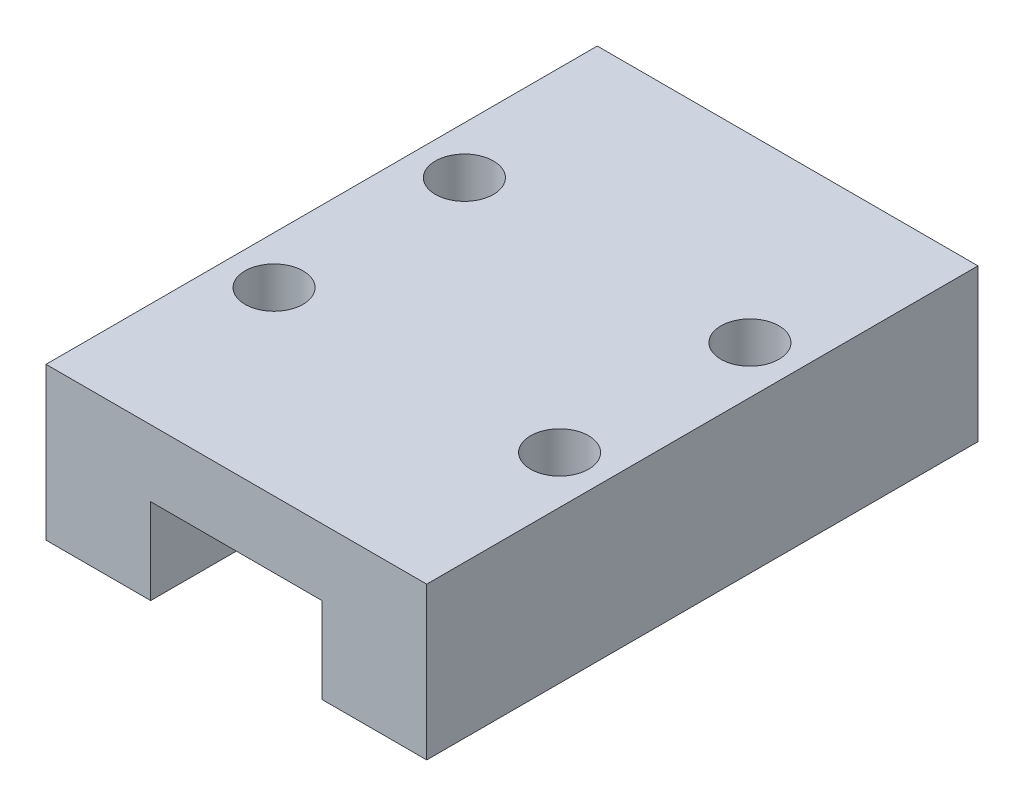
ISO-10303-21;
HEADER;
FILE_DESCRIPTION(('STEP AP214'),'2;1');
FILE_NAME('part.step','',(''),(''),'','','');
FILE_SCHEMA(('AUTOMOTIVE_DESIGN { 1 0 10303 214 1 1 1 1 }'));
ENDSEC;
DATA;
#1=APPLICATION_CONTEXT('core data for automotive mechanical design processes');
#2=APPLICATION_PROTOCOL_DEFINITION('international standard','automotive_design',2000,#1);
#3=PRODUCT_CONTEXT('',#1,'mechanical');
#4=PRODUCT('Part','Part','',(#3));
#5=PRODUCT_RELATED_PRODUCT_CATEGORY('part','',(#4));
#6=PRODUCT_DEFINITION_FORMATION('','',#4);
#7=PRODUCT_DEFINITION_CONTEXT('part definition',#1,'design');
#8=PRODUCT_DEFINITION('design','',#6,#7);
#9=PRODUCT_DEFINITION_SHAPE('','',#8);
#10=(LENGTH_UNIT() NAMED_UNIT(*) SI_UNIT(.MILLI.,.METRE.));
#11=(NAMED_UNIT(*) PLANE_ANGLE_UNIT() SI_UNIT($,.RADIAN.));
#12=(NAMED_UNIT(*) SI_UNIT($,.STERADIAN.) SOLID_ANGLE_UNIT());
#13=UNCERTAINTY_MEASURE_WITH_UNIT(LENGTH_MEASURE(1.E-05),#10,'distance_accuracy_value','');
#14=(GEOMETRIC_REPRESENTATION_CONTEXT(3) GLOBAL_UNCERTAINTY_ASSIGNED_CONTEXT((#13)) GLOBAL_UNIT_ASSIGNED_CONTEXT((#10,
#11,#12)) REPRESENTATION_CONTEXT('',''));
#15=CARTESIAN_POINT('',(0.,0.,0.));
#16=DIRECTION('',(0.,0.,1.));
#17=DIRECTION('',(1.,0.,0.));
#18=AXIS2_PLACEMENT_3D('',#15,#16,#17);
#19=CARTESIAN_POINT('',(4.5,0.,28.96));
#20=DIRECTION('',(1.,0.,0.));
#21=DIRECTION('',(0.,0.,-1.));
#22=AXIS2_PLACEMENT_3D('',#19,#20,#21);
#23=PLANE('',#22);
#24=DIRECTION('',(0.,-1.,0.));
#25=VECTOR('',#24,1.);
#26=CARTESIAN_POINT('',(4.5,0.,0.));
#27=LINE('',#26,#25);
#28=CARTESIAN_POINT('',(4.5,4.5,0.));
#29=VERTEX_POINT('',#28);
#30=CARTESIAN_POINT('',(4.5,0.,0.));
#31=VERTEX_POINT('',#30);
#32=EDGE_CURVE('E143',#29,#31,#27,.T.);
#33=ORIENTED_EDGE('',*,*,#32,.T.);
#34=DIRECTION('',(0.,0.,-1.));
#35=VECTOR('',#34,1.);
#36=CARTESIAN_POINT('',(4.5,0.,28.96));
#37=LINE('',#36,#35);
#38=CARTESIAN_POINT('',(4.5,0.,28.96));
#39=VERTEX_POINT('',#38);
#40=EDGE_CURVE('E11',#39,#31,#37,.T.);
#41=ORIENTED_EDGE('',*,*,#40,.F.);
#42=DIRECTION('',(0.,-1.,0.));
#43=VECTOR('',#42,1.);
#44=CARTESIAN_POINT('',(4.5,0.,28.96));
#45=LINE('',#44,#43);
#46=CARTESIAN_POINT('',(4.5,4.5,28.96));
#47=VERTEX_POINT('',#46);
#48=EDGE_CURVE('E156',#47,#39,#45,.T.);
#49=ORIENTED_EDGE('',*,*,#48,.F.);
#50=DIRECTION('',(0.,0.,-1.));
#51=VECTOR('',#50,1.);
#52=CARTESIAN_POINT('',(4.5,4.5,28.96));
#53=LINE('',#52,#51);
#54=EDGE_CURVE('E140',#47,#29,#53,.T.);
#55=ORIENTED_EDGE('',*,*,#54,.T.);
#56=EDGE_LOOP('',(#33,#41,#49,#55));
#57=FACE_BOUND('',#56,.T.);
#58=ADVANCED_FACE('F44',(#57),#23,.F.);
#59=CARTESIAN_POINT('',(10.,0.,28.96));
#60=DIRECTION('',(0.,1.,0.));
#61=DIRECTION('',(-1.,0.,0.));
#62=AXIS2_PLACEMENT_3D('',#59,#60,#61);
#63=PLANE('',#62);
#64=DIRECTION('',(1.,0.,0.));
#65=VECTOR('',#64,1.);
#66=CARTESIAN_POINT('',(10.,0.,0.));
#67=LINE('',#66,#65);
#68=CARTESIAN_POINT('',(10.,0.,0.));
#69=VERTEX_POINT('',#68);
#70=EDGE_CURVE('E145',#31,#69,#67,.T.);
#71=ORIENTED_EDGE('',*,*,#70,.T.);
#72=DIRECTION('',(0.,0.,-1.));
#73=VECTOR('',#72,1.);
#74=CARTESIAN_POINT('',(10.,0.,28.96));
#75=LINE('',#74,#73);
#76=CARTESIAN_POINT('',(10.,0.,28.96));
#77=VERTEX_POINT('',#76);
#78=EDGE_CURVE('E52',#77,#69,#75,.T.);
#79=ORIENTED_EDGE('',*,*,#78,.F.);
#80=DIRECTION('',(1.,0.,0.));
#81=VECTOR('',#80,1.);
#82=CARTESIAN_POINT('',(10.,0.,28.96));
#83=LINE('',#82,#81);
#84=EDGE_CURVE('E102',#39,#77,#83,.T.);
#85=ORIENTED_EDGE('',*,*,#84,.F.);
#86=ORIENTED_EDGE('',*,*,#40,.T.);
#87=EDGE_LOOP('',(#71,#79,#85,#86));
#88=FACE_BOUND('',#87,.T.);
#89=ADVANCED_FACE('F242',(#88),#63,.F.);
#90=CARTESIAN_POINT('',(10.,8.,28.96));
#91=DIRECTION('',(-1.,0.,0.));
#92=DIRECTION('',(0.,-1.,0.));
#93=AXIS2_PLACEMENT_3D('',#90,#91,#92);
#94=PLANE('',#93);
#95=DIRECTION('',(0.,1.,0.));
#96=VECTOR('',#95,1.);
#97=CARTESIAN_POINT('',(10.,8.,0.));
#98=LINE('',#97,#96);
#99=CARTESIAN_POINT('',(10.,8.,0.));
#100=VERTEX_POINT('',#99);
#101=EDGE_CURVE('E150',#69,#100,#98,.T.);
#102=ORIENTED_EDGE('',*,*,#101,.T.);
#103=DIRECTION('',(0.,0.,-1.));
#104=VECTOR('',#103,1.);
#105=CARTESIAN_POINT('',(10.,8.,28.96));
#106=LINE('',#105,#104);
#107=CARTESIAN_POINT('',(10.,8.,28.96));
#108=VERTEX_POINT('',#107);
#109=EDGE_CURVE('E162',#108,#100,#106,.T.);
#110=ORIENTED_EDGE('',*,*,#109,.F.);
#111=DIRECTION('',(0.,1.,0.));
#112=VECTOR('',#111,1.);
#113=CARTESIAN_POINT('',(10.,8.,28.96));
#114=LINE('',#113,#112);
#115=EDGE_CURVE('E173',#77,#108,#114,.T.);
#116=ORIENTED_EDGE('',*,*,#115,.F.);
#117=ORIENTED_EDGE('',*,*,#78,.T.);
#118=EDGE_LOOP('',(#102,#110,#116,#117));
#119=FACE_BOUND('',#118,.T.);
#120=ADVANCED_FACE('F166',(#119),#94,.F.);
#121=CARTESIAN_POINT('',(-10.,8.,28.96));
#122=DIRECTION('',(0.,-1.,0.));
#123=DIRECTION('',(1.,0.,0.));
#124=AXIS2_PLACEMENT_3D('',#121,#122,#123);
#125=PLANE('',#124);
#126=CARTESIAN_POINT('',(-7.5,8.,9.48));
#127=DIRECTION('',(0.,1.,0.));
#128=DIRECTION('',(1.,0.,0.));
#129=AXIS2_PLACEMENT_3D('',#126,#127,#128);
#130=CIRCLE('',#129,1.525);
#131=CARTESIAN_POINT('',(-5.975,8.,9.48));
#132=VERTEX_POINT('',#131);
#133=EDGE_CURVE('E194',#132,#132,#130,.T.);
#134=ORIENTED_EDGE('',*,*,#133,.F.);
#135=EDGE_LOOP('',(#134));
#136=FACE_BOUND('',#135,.T.);
#137=CARTESIAN_POINT('',(-7.5,8.,19.48));
#138=DIRECTION('',(0.,1.,0.));
#139=DIRECTION('',(-1.,0.,0.));
#140=AXIS2_PLACEMENT_3D('',#137,#138,#139);
#141=CIRCLE('',#140,1.525);
#142=CARTESIAN_POINT('',(-9.025,8.,19.48));
#143=VERTEX_POINT('',#142);
#144=EDGE_CURVE('E203',#143,#143,#141,.T.);
#145=ORIENTED_EDGE('',*,*,#144,.F.);
#146=EDGE_LOOP('',(#145));
#147=FACE_BOUND('',#146,.T.);
#148=CARTESIAN_POINT('',(7.5,8.,19.48));
#149=DIRECTION('',(0.,1.,0.));
#150=DIRECTION('',(1.,0.,0.));
#151=AXIS2_PLACEMENT_3D('',#148,#149,#150);
#152=CIRCLE('',#151,1.525);
#153=CARTESIAN_POINT('',(9.02500000000001,8.,19.48));
#154=VERTEX_POINT('',#153);
#155=EDGE_CURVE('E210',#154,#154,#152,.T.);
#156=ORIENTED_EDGE('',*,*,#155,.F.);
#157=EDGE_LOOP('',(#156));
#158=FACE_BOUND('',#157,.T.);
#159=CARTESIAN_POINT('',(7.5,8.,9.48));
#160=DIRECTION('',(0.,1.,0.));
#161=DIRECTION('',(-1.,0.,0.));
#162=AXIS2_PLACEMENT_3D('',#159,#160,#161);
#163=CIRCLE('',#162,1.525);
#164=CARTESIAN_POINT('',(5.975,8.,9.48));
#165=VERTEX_POINT('',#164);
#166=EDGE_CURVE('E190',#165,#165,#163,.T.);
#167=ORIENTED_EDGE('',*,*,#166,.F.);
#168=EDGE_LOOP('',(#167));
#169=FACE_BOUND('',#168,.T.);
#170=DIRECTION('',(-1.,0.,0.));
#171=VECTOR('',#170,1.);
#172=CARTESIAN_POINT('',(-10.,8.,0.));
#173=LINE('',#172,#171);
#174=CARTESIAN_POINT('',(-10.,8.,0.));
#175=VERTEX_POINT('',#174);
#176=EDGE_CURVE('E149',#100,#175,#173,.T.);
#177=ORIENTED_EDGE('',*,*,#176,.T.);
#178=DIRECTION('',(0.,0.,-1.));
#179=VECTOR('',#178,1.);
#180=CARTESIAN_POINT('',(-10.,8.,28.96));
#181=LINE('',#180,#179);
#182=CARTESIAN_POINT('',(-10.,8.,28.96));
#183=VERTEX_POINT('',#182);
#184=EDGE_CURVE('E159',#183,#175,#181,.T.);
#185=ORIENTED_EDGE('',*,*,#184,.F.);
#186=DIRECTION('',(-1.,0.,0.));
#187=VECTOR('',#186,1.);
#188=CARTESIAN_POINT('',(-10.,8.,28.96));
#189=LINE('',#188,#187);
#190=EDGE_CURVE('E181',#108,#183,#189,.T.);
#191=ORIENTED_EDGE('',*,*,#190,.F.);
#192=ORIENTED_EDGE('',*,*,#109,.T.);
#193=EDGE_LOOP('',(#177,#185,#191,#192));
#194=FACE_BOUND('',#193,.T.);
#195=ADVANCED_FACE('F177',(#136,#147,#158,#169,#194),#125,.F.);
#196=CARTESIAN_POINT('',(-10.,8.,28.96));
#197=DIRECTION('',(1.,0.,0.));
#198=DIRECTION('',(0.,1.,0.));
#199=AXIS2_PLACEMENT_3D('',#196,#197,#198);
#200=PLANE('',#199);
#201=DIRECTION('',(0.,-1.,0.));
#202=VECTOR('',#201,1.);
#203=CARTESIAN_POINT('',(-10.,8.,0.));
#204=LINE('',#203,#202);
#205=CARTESIAN_POINT('',(-10.,0.,0.));
#206=VERTEX_POINT('',#205);
#207=EDGE_CURVE('E151',#175,#206,#204,.T.);
#208=ORIENTED_EDGE('',*,*,#207,.T.);
#209=DIRECTION('',(0.,0.,-1.));
#210=VECTOR('',#209,1.);
#211=CARTESIAN_POINT('',(-10.,0.,28.96));
#212=LINE('',#211,#210);
#213=CARTESIAN_POINT('',(-10.,0.,28.96));
#214=VERTEX_POINT('',#213);
#215=EDGE_CURVE('E134',#214,#206,#212,.T.);
#216=ORIENTED_EDGE('',*,*,#215,.F.);
#217=DIRECTION('',(0.,-1.,0.));
#218=VECTOR('',#217,1.);
#219=CARTESIAN_POINT('',(-10.,8.,28.96));
#220=LINE('',#219,#218);
#221=EDGE_CURVE('E123',#183,#214,#220,.T.);
#222=ORIENTED_EDGE('',*,*,#221,.F.);
#223=ORIENTED_EDGE('',*,*,#184,.T.);
#224=EDGE_LOOP('',(#208,#216,#222,#223));
#225=FACE_BOUND('',#224,.T.);
#226=ADVANCED_FACE('F185',(#225),#200,.F.);
#227=CARTESIAN_POINT('',(-10.,0.,28.96));
#228=DIRECTION('',(0.,1.,0.));
#229=DIRECTION('',(-1.,0.,0.));
#230=AXIS2_PLACEMENT_3D('',#227,#228,#229);
#231=PLANE('',#230);
#232=DIRECTION('',(1.,0.,0.));
#233=VECTOR('',#232,1.);
#234=CARTESIAN_POINT('',(-10.,0.,0.));
#235=LINE('',#234,#233);
#236=CARTESIAN_POINT('',(-4.5,0.,0.));
#237=VERTEX_POINT('',#236);
#238=EDGE_CURVE('E133',#206,#237,#235,.T.);
#239=ORIENTED_EDGE('',*,*,#238,.T.);
#240=DIRECTION('',(0.,0.,-1.));
#241=VECTOR('',#240,1.);
#242=CARTESIAN_POINT('',(-4.5,0.,28.96));
#243=LINE('',#242,#241);
#244=CARTESIAN_POINT('',(-4.5,0.,28.96));
#245=VERTEX_POINT('',#244);
#246=EDGE_CURVE('E126',#245,#237,#243,.T.);
#247=ORIENTED_EDGE('',*,*,#246,.F.);
#248=DIRECTION('',(1.,0.,0.));
#249=VECTOR('',#248,1.);
#250=CARTESIAN_POINT('',(-10.,0.,28.96));
#251=LINE('',#250,#249);
#252=EDGE_CURVE('E119',#214,#245,#251,.T.);
#253=ORIENTED_EDGE('',*,*,#252,.F.);
#254=ORIENTED_EDGE('',*,*,#215,.T.);
#255=EDGE_LOOP('',(#239,#247,#253,#254));
#256=FACE_BOUND('',#255,.T.);
#257=ADVANCED_FACE('F129',(#256),#231,.F.);
#258=CARTESIAN_POINT('',(-4.5,0.,28.96));
#259=DIRECTION('',(-1.,0.,0.));
#260=DIRECTION('',(0.,0.,1.));
#261=AXIS2_PLACEMENT_3D('',#258,#259,#260);
#262=PLANE('',#261);
#263=DIRECTION('',(0.,1.,0.));
#264=VECTOR('',#263,1.);
#265=CARTESIAN_POINT('',(-4.5,0.,0.));
#266=LINE('',#265,#264);
#267=CARTESIAN_POINT('',(-4.5,4.5,0.));
#268=VERTEX_POINT('',#267);
#269=EDGE_CURVE('E89',#237,#268,#266,.T.);
#270=ORIENTED_EDGE('',*,*,#269,.T.);
#271=DIRECTION('',(0.,0.,-1.));
#272=VECTOR('',#271,1.);
#273=CARTESIAN_POINT('',(-4.5,4.5,28.96));
#274=LINE('',#273,#272);
#275=CARTESIAN_POINT('',(-4.5,4.5,28.96));
#276=VERTEX_POINT('',#275);
#277=EDGE_CURVE('E132',#276,#268,#274,.T.);
#278=ORIENTED_EDGE('',*,*,#277,.F.);
#279=DIRECTION('',(0.,1.,0.));
#280=VECTOR('',#279,1.);
#281=CARTESIAN_POINT('',(-4.5,0.,28.96));
#282=LINE('',#281,#280);
#283=EDGE_CURVE('E121',#245,#276,#282,.T.);
#284=ORIENTED_EDGE('',*,*,#283,.F.);
#285=ORIENTED_EDGE('',*,*,#246,.T.);
#286=EDGE_LOOP('',(#270,#278,#284,#285));
#287=FACE_BOUND('',#286,.T.);
#288=ADVANCED_FACE('F131',(#287),#262,.F.);
#289=CARTESIAN_POINT('',(4.5,4.5,28.96));
#290=DIRECTION('',(0.,1.,0.));
#291=DIRECTION('',(0.,0.,1.));
#292=AXIS2_PLACEMENT_3D('',#289,#290,#291);
#293=PLANE('',#292);
#294=DIRECTION('',(1.,0.,0.));
#295=VECTOR('',#294,1.);
#296=CARTESIAN_POINT('',(4.5,4.5,0.));
#297=LINE('',#296,#295);
#298=EDGE_CURVE('E96',#268,#29,#297,.T.);
#299=ORIENTED_EDGE('',*,*,#298,.T.);
#300=ORIENTED_EDGE('',*,*,#54,.F.);
#301=DIRECTION('',(1.,0.,0.));
#302=VECTOR('',#301,1.);
#303=CARTESIAN_POINT('',(4.5,4.5,28.96));
#304=LINE('',#303,#302);
#305=EDGE_CURVE('E63',#276,#47,#304,.T.);
#306=ORIENTED_EDGE('',*,*,#305,.F.);
#307=ORIENTED_EDGE('',*,*,#277,.T.);
#308=EDGE_LOOP('',(#299,#300,#306,#307));
#309=FACE_BOUND('',#308,.T.);
#310=ADVANCED_FACE('F249',(#309),#293,.F.);
#311=CARTESIAN_POINT('',(0.,0.,28.96));
#312=DIRECTION('',(0.,0.,1.));
#313=DIRECTION('',(1.,0.,0.));
#314=AXIS2_PLACEMENT_3D('',#311,#312,#313);
#315=PLANE('',#314);
#316=ORIENTED_EDGE('',*,*,#48,.T.);
#317=ORIENTED_EDGE('',*,*,#84,.T.);
#318=ORIENTED_EDGE('',*,*,#115,.T.);
#319=ORIENTED_EDGE('',*,*,#190,.T.);
#320=ORIENTED_EDGE('',*,*,#221,.T.);
#321=ORIENTED_EDGE('',*,*,#252,.T.);
#322=ORIENTED_EDGE('',*,*,#283,.T.);
#323=ORIENTED_EDGE('',*,*,#305,.T.);
#324=EDGE_LOOP('',(#316,#317,#318,#319,#320,#321,#322,#323));
#325=FACE_BOUND('',#324,.T.);
#326=ADVANCED_FACE('F120',(#325),#315,.T.);
#327=CARTESIAN_POINT('',(0.,0.,0.));
#328=DIRECTION('',(0.,0.,1.));
#329=DIRECTION('',(1.,0.,0.));
#330=AXIS2_PLACEMENT_3D('',#327,#328,#329);
#331=PLANE('',#330);
#332=ORIENTED_EDGE('',*,*,#32,.F.);
#333=ORIENTED_EDGE('',*,*,#298,.F.);
#334=ORIENTED_EDGE('',*,*,#269,.F.);
#335=ORIENTED_EDGE('',*,*,#238,.F.);
#336=ORIENTED_EDGE('',*,*,#207,.F.);
#337=ORIENTED_EDGE('',*,*,#176,.F.);
#338=ORIENTED_EDGE('',*,*,#101,.F.);
#339=ORIENTED_EDGE('',*,*,#70,.F.);
#340=EDGE_LOOP('',(#332,#333,#334,#335,#336,#337,#338,#339));
#341=FACE_BOUND('',#340,.T.);
#342=ADVANCED_FACE('F171',(#341),#331,.F.);
#343=CARTESIAN_POINT('',(7.5,5.,9.48));
#344=DIRECTION('',(0.,1.,0.));
#345=DIRECTION('',(-1.,0.,0.));
#346=AXIS2_PLACEMENT_3D('',#343,#344,#345);
#347=CYLINDRICAL_SURFACE('',#346,1.525);
#348=CARTESIAN_POINT('',(7.5,5.,9.48));
#349=DIRECTION('',(0.,1.,0.));
#350=DIRECTION('',(-1.,0.,0.));
#351=AXIS2_PLACEMENT_3D('',#348,#349,#350);
#352=CIRCLE('',#351,1.525);
#353=CARTESIAN_POINT('',(5.975,5.,9.48));
#354=VERTEX_POINT('',#353);
#355=EDGE_CURVE('E144',#354,#354,#352,.T.);
#356=ORIENTED_EDGE('',*,*,#355,.F.);
#357=EDGE_LOOP('',(#356));
#358=FACE_BOUND('',#357,.T.);
#359=ORIENTED_EDGE('',*,*,#166,.T.);
#360=EDGE_LOOP('',(#359));
#361=FACE_BOUND('',#360,.T.);
#362=ADVANCED_FACE('F227',(#358,#361),#347,.F.);
#363=CARTESIAN_POINT('',(7.5,5.,9.48));
#364=DIRECTION('',(0.,1.,0.));
#365=DIRECTION('',(-1.,0.,0.));
#366=AXIS2_PLACEMENT_3D('',#363,#364,#365);
#367=PLANE('',#366);
#368=ORIENTED_EDGE('',*,*,#355,.T.);
#369=EDGE_LOOP('',(#368));
#370=FACE_BOUND('',#369,.T.);
#371=ADVANCED_FACE('F217',(#370),#367,.T.);
#372=CARTESIAN_POINT('',(7.5,5.,19.48));
#373=DIRECTION('',(0.,1.,0.));
#374=DIRECTION('',(-1.,0.,0.));
#375=AXIS2_PLACEMENT_3D('',#372,#373,#374);
#376=CYLINDRICAL_SURFACE('',#375,1.525);
#377=CARTESIAN_POINT('',(7.5,5.,19.48));
#378=DIRECTION('',(0.,1.,0.));
#379=DIRECTION('',(1.,0.,0.));
#380=AXIS2_PLACEMENT_3D('',#377,#378,#379);
#381=CIRCLE('',#380,1.525);
#382=CARTESIAN_POINT('',(9.02500000000001,5.,19.48));
#383=VERTEX_POINT('',#382);
#384=EDGE_CURVE('E195',#383,#383,#381,.T.);
#385=ORIENTED_EDGE('',*,*,#384,.F.);
#386=EDGE_LOOP('',(#385));
#387=FACE_BOUND('',#386,.T.);
#388=ORIENTED_EDGE('',*,*,#155,.T.);
#389=EDGE_LOOP('',(#388));
#390=FACE_BOUND('',#389,.T.);
#391=ADVANCED_FACE('F214',(#387,#390),#376,.F.);
#392=CARTESIAN_POINT('',(7.5,5.,19.48));
#393=DIRECTION('',(0.,-1.,0.));
#394=DIRECTION('',(1.,0.,0.));
#395=AXIS2_PLACEMENT_3D('',#392,#393,#394);
#396=PLANE('',#395);
#397=ORIENTED_EDGE('',*,*,#384,.T.);
#398=EDGE_LOOP('',(#397));
#399=FACE_BOUND('',#398,.T.);
#400=ADVANCED_FACE('F213',(#399),#396,.F.);
#401=CARTESIAN_POINT('',(-7.5,5.,19.48));
#402=DIRECTION('',(0.,1.,0.));
#403=DIRECTION('',(-1.,0.,0.));
#404=AXIS2_PLACEMENT_3D('',#401,#402,#403);
#405=CYLINDRICAL_SURFACE('',#404,1.525);
#406=CARTESIAN_POINT('',(-7.5,5.,19.48));
#407=DIRECTION('',(0.,1.,0.));
#408=DIRECTION('',(-1.,0.,0.));
#409=AXIS2_PLACEMENT_3D('',#406,#407,#408);
#410=CIRCLE('',#409,1.525);
#411=CARTESIAN_POINT('',(-9.025,5.,19.48));
#412=VERTEX_POINT('',#411);
#413=EDGE_CURVE('E204',#412,#412,#410,.T.);
#414=ORIENTED_EDGE('',*,*,#413,.F.);
#415=EDGE_LOOP('',(#414));
#416=FACE_BOUND('',#415,.T.);
#417=ORIENTED_EDGE('',*,*,#144,.T.);
#418=EDGE_LOOP('',(#417));
#419=FACE_BOUND('',#418,.T.);
#420=ADVANCED_FACE('F306',(#416,#419),#405,.F.);
#421=CARTESIAN_POINT('',(-7.5,5.,19.48));
#422=DIRECTION('',(0.,1.,0.));
#423=DIRECTION('',(-1.,0.,0.));
#424=AXIS2_PLACEMENT_3D('',#421,#422,#423);
#425=PLANE('',#424);
#426=ORIENTED_EDGE('',*,*,#413,.T.);
#427=EDGE_LOOP('',(#426));
#428=FACE_BOUND('',#427,.T.);
#429=ADVANCED_FACE('F312',(#428),#425,.T.);
#430=CARTESIAN_POINT('',(-7.5,5.,9.48));
#431=DIRECTION('',(0.,1.,0.));
#432=DIRECTION('',(-1.,0.,0.));
#433=AXIS2_PLACEMENT_3D('',#430,#431,#432);
#434=CYLINDRICAL_SURFACE('',#433,1.525);
#435=CARTESIAN_POINT('',(-7.5,5.,9.48));
#436=DIRECTION('',(0.,1.,0.));
#437=DIRECTION('',(1.,0.,0.));
#438=AXIS2_PLACEMENT_3D('',#435,#436,#437);
#439=CIRCLE('',#438,1.525);
#440=CARTESIAN_POINT('',(-5.975,5.,9.48));
#441=VERTEX_POINT('',#440);
#442=EDGE_CURVE('E196',#441,#441,#439,.T.);
#443=ORIENTED_EDGE('',*,*,#442,.F.);
#444=EDGE_LOOP('',(#443));
#445=FACE_BOUND('',#444,.T.);
#446=ORIENTED_EDGE('',*,*,#133,.T.);
#447=EDGE_LOOP('',(#446));
#448=FACE_BOUND('',#447,.T.);
#449=ADVANCED_FACE('F323',(#445,#448),#434,.F.);
#450=CARTESIAN_POINT('',(-7.5,5.,9.48));
#451=DIRECTION('',(0.,-1.,0.));
#452=DIRECTION('',(1.,0.,0.));
#453=AXIS2_PLACEMENT_3D('',#450,#451,#452);
#454=PLANE('',#453);
#455=ORIENTED_EDGE('',*,*,#442,.T.);
#456=EDGE_LOOP('',(#455));
#457=FACE_BOUND('',#456,.T.);
#458=ADVANCED_FACE('F332',(#457),#454,.F.);
#459=CLOSED_SHELL('',(#58,#89,#120,#195,#226,#257,#288,#310,#326,#342,#362,#371,#391,#400,#420,
#429,#449,#458));
#460=MANIFOLD_SOLID_BREP('B2',#459);
#461=ADVANCED_BREP_SHAPE_REPRESENTATION('',(#18,#460),#14);
#462=SHAPE_DEFINITION_REPRESENTATION(#9,#461);
ENDSEC;
END-ISO-10303-21;
